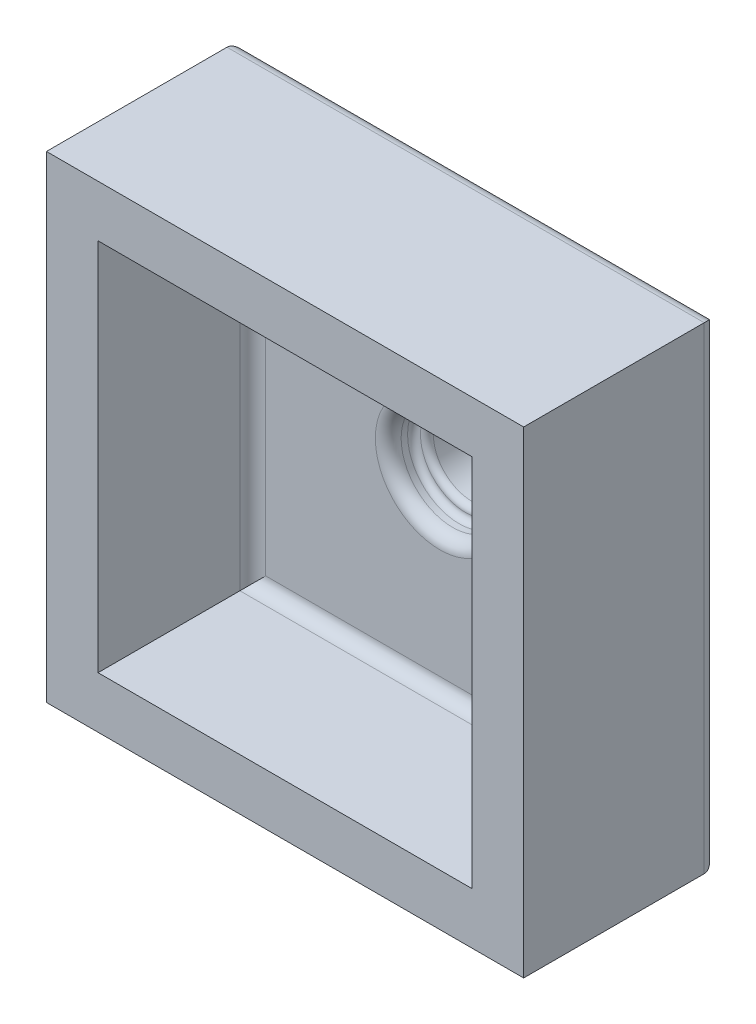
ISO-10303-21;
HEADER;
FILE_DESCRIPTION(('STEP AP214'),'2;1');
FILE_NAME('part.step','',(''),(''),'','','');
FILE_SCHEMA(('AUTOMOTIVE_DESIGN { 1 0 10303 214 1 1 1 1 }'));
ENDSEC;
DATA;
#1=APPLICATION_CONTEXT('core data for automotive mechanical design processes');
#2=APPLICATION_PROTOCOL_DEFINITION('international standard','automotive_design',2000,#1);
#3=PRODUCT_CONTEXT('',#1,'mechanical');
#4=PRODUCT('Part','Part','',(#3));
#5=PRODUCT_RELATED_PRODUCT_CATEGORY('part','',(#4));
#6=PRODUCT_DEFINITION_FORMATION('','',#4);
#7=PRODUCT_DEFINITION_CONTEXT('part definition',#1,'design');
#8=PRODUCT_DEFINITION('design','',#6,#7);
#9=PRODUCT_DEFINITION_SHAPE('','',#8);
#10=(LENGTH_UNIT() NAMED_UNIT(*) SI_UNIT(.MILLI.,.METRE.));
#11=(NAMED_UNIT(*) PLANE_ANGLE_UNIT() SI_UNIT($,.RADIAN.));
#12=(NAMED_UNIT(*) SI_UNIT($,.STERADIAN.) SOLID_ANGLE_UNIT());
#13=UNCERTAINTY_MEASURE_WITH_UNIT(LENGTH_MEASURE(1.E-05),#10,'distance_accuracy_value','');
#14=(GEOMETRIC_REPRESENTATION_CONTEXT(3) GLOBAL_UNCERTAINTY_ASSIGNED_CONTEXT((#13)) GLOBAL_UNIT_ASSIGNED_CONTEXT((#10,
#11,#12)) REPRESENTATION_CONTEXT('',''));
#15=CARTESIAN_POINT('',(0.,0.,0.));
#16=DIRECTION('',(0.,0.,1.));
#17=DIRECTION('',(1.,0.,0.));
#18=AXIS2_PLACEMENT_3D('',#15,#16,#17);
#19=CARTESIAN_POINT('',(0.,0.,12.));
#20=DIRECTION('',(0.,0.,-1.));
#21=DIRECTION('',(-1.,0.,0.));
#22=AXIS2_PLACEMENT_3D('',#19,#20,#21);
#23=CYLINDRICAL_SURFACE('',#22,4.);
#24=CARTESIAN_POINT('',(0.,0.,1.5));
#25=DIRECTION('',(0.,0.,-1.));
#26=DIRECTION('',(-1.,0.,0.));
#27=AXIS2_PLACEMENT_3D('',#24,#25,#26);
#28=CIRCLE('',#27,4.);
#29=CARTESIAN_POINT('',(-4.,0.,1.5));
#30=VERTEX_POINT('',#29);
#31=EDGE_CURVE('E49',#30,#30,#28,.T.);
#32=ORIENTED_EDGE('',*,*,#31,.T.);
#33=EDGE_LOOP('',(#32));
#34=FACE_BOUND('',#33,.T.);
#35=CARTESIAN_POINT('',(0.,0.,2.));
#36=DIRECTION('',(0.,0.,-1.));
#37=DIRECTION('',(-1.,0.,0.));
#38=AXIS2_PLACEMENT_3D('',#35,#36,#37);
#39=CIRCLE('',#38,4.);
#40=CARTESIAN_POINT('',(-4.,0.,2.));
#41=VERTEX_POINT('',#40);
#42=EDGE_CURVE('E272',#41,#41,#39,.F.);
#43=ORIENTED_EDGE('',*,*,#42,.T.);
#44=EDGE_LOOP('',(#43));
#45=FACE_BOUND('',#44,.T.);
#46=ADVANCED_FACE('F39',(#34,#45),#23,.F.);
#47=CARTESIAN_POINT('',(-18.5,18.5,15.));
#48=DIRECTION('',(1.,0.,0.));
#49=DIRECTION('',(0.,1.,0.));
#50=AXIS2_PLACEMENT_3D('',#47,#48,#49);
#51=PLANE('',#50);
#52=DIRECTION('',(0.,0.,-1.));
#53=VECTOR('',#52,1.);
#54=CARTESIAN_POINT('',(-18.5,18.5,15.));
#55=LINE('',#54,#53);
#56=CARTESIAN_POINT('',(-18.5,18.5,15.));
#57=VERTEX_POINT('',#56);
#58=CARTESIAN_POINT('',(-18.5,18.5,1.));
#59=VERTEX_POINT('',#58);
#60=EDGE_CURVE('E178',#57,#59,#55,.T.);
#61=ORIENTED_EDGE('',*,*,#60,.T.);
#62=DIRECTION('',(0.,-1.,0.));
#63=VECTOR('',#62,1.);
#64=CARTESIAN_POINT('',(-18.5,-18.5,1.));
#65=LINE('',#64,#63);
#66=CARTESIAN_POINT('',(-18.5,-18.5,1.));
#67=VERTEX_POINT('',#66);
#68=EDGE_CURVE('E221',#59,#67,#65,.T.);
#69=ORIENTED_EDGE('',*,*,#68,.T.);
#70=DIRECTION('',(0.,0.,-1.));
#71=VECTOR('',#70,1.);
#72=CARTESIAN_POINT('',(-18.5,-18.5,15.));
#73=LINE('',#72,#71);
#74=CARTESIAN_POINT('',(-18.5,-18.5,15.));
#75=VERTEX_POINT('',#74);
#76=EDGE_CURVE('E190',#75,#67,#73,.T.);
#77=ORIENTED_EDGE('',*,*,#76,.F.);
#78=DIRECTION('',(0.,-1.,0.));
#79=VECTOR('',#78,1.);
#80=CARTESIAN_POINT('',(-18.5,18.5,15.));
#81=LINE('',#80,#79);
#82=EDGE_CURVE('E161',#57,#75,#81,.T.);
#83=ORIENTED_EDGE('',*,*,#82,.F.);
#84=EDGE_LOOP('',(#61,#69,#77,#83));
#85=FACE_BOUND('',#84,.T.);
#86=ADVANCED_FACE('F349',(#85),#51,.F.);
#87=CARTESIAN_POINT('',(18.5,-18.5,15.));
#88=DIRECTION('',(0.,1.,0.));
#89=DIRECTION('',(-1.,0.,0.));
#90=AXIS2_PLACEMENT_3D('',#87,#88,#89);
#91=PLANE('',#90);
#92=ORIENTED_EDGE('',*,*,#76,.T.);
#93=DIRECTION('',(1.,0.,0.));
#94=VECTOR('',#93,1.);
#95=CARTESIAN_POINT('',(18.5,-18.5,1.));
#96=LINE('',#95,#94);
#97=CARTESIAN_POINT('',(18.5,-18.5,1.));
#98=VERTEX_POINT('',#97);
#99=EDGE_CURVE('E194',#67,#98,#96,.T.);
#100=ORIENTED_EDGE('',*,*,#99,.T.);
#101=DIRECTION('',(0.,0.,-1.));
#102=VECTOR('',#101,1.);
#103=CARTESIAN_POINT('',(18.5,-18.5,15.));
#104=LINE('',#103,#102);
#105=CARTESIAN_POINT('',(18.5,-18.5,15.));
#106=VERTEX_POINT('',#105);
#107=EDGE_CURVE('E186',#106,#98,#104,.T.);
#108=ORIENTED_EDGE('',*,*,#107,.F.);
#109=DIRECTION('',(1.,0.,0.));
#110=VECTOR('',#109,1.);
#111=CARTESIAN_POINT('',(18.5,-18.5,15.));
#112=LINE('',#111,#110);
#113=EDGE_CURVE('E169',#75,#106,#112,.T.);
#114=ORIENTED_EDGE('',*,*,#113,.F.);
#115=EDGE_LOOP('',(#92,#100,#108,#114));
#116=FACE_BOUND('',#115,.T.);
#117=ADVANCED_FACE('F354',(#116),#91,.F.);
#118=CARTESIAN_POINT('',(18.5,18.5,15.));
#119=DIRECTION('',(-1.,0.,0.));
#120=DIRECTION('',(0.,-1.,0.));
#121=AXIS2_PLACEMENT_3D('',#118,#119,#120);
#122=PLANE('',#121);
#123=ORIENTED_EDGE('',*,*,#107,.T.);
#124=DIRECTION('',(0.,1.,0.));
#125=VECTOR('',#124,1.);
#126=CARTESIAN_POINT('',(18.5,18.5,1.));
#127=LINE('',#126,#125);
#128=CARTESIAN_POINT('',(18.5,18.5,1.));
#129=VERTEX_POINT('',#128);
#130=EDGE_CURVE('E215',#98,#129,#127,.T.);
#131=ORIENTED_EDGE('',*,*,#130,.T.);
#132=DIRECTION('',(0.,0.,-1.));
#133=VECTOR('',#132,1.);
#134=CARTESIAN_POINT('',(18.5,18.5,15.));
#135=LINE('',#134,#133);
#136=CARTESIAN_POINT('',(18.5,18.5,15.));
#137=VERTEX_POINT('',#136);
#138=EDGE_CURVE('E182',#137,#129,#135,.T.);
#139=ORIENTED_EDGE('',*,*,#138,.F.);
#140=DIRECTION('',(0.,1.,0.));
#141=VECTOR('',#140,1.);
#142=CARTESIAN_POINT('',(18.5,18.5,15.));
#143=LINE('',#142,#141);
#144=EDGE_CURVE('E172',#106,#137,#143,.T.);
#145=ORIENTED_EDGE('',*,*,#144,.F.);
#146=EDGE_LOOP('',(#123,#131,#139,#145));
#147=FACE_BOUND('',#146,.T.);
#148=ADVANCED_FACE('F380',(#147),#122,.F.);
#149=CARTESIAN_POINT('',(18.5,18.5,15.));
#150=DIRECTION('',(0.,-1.,0.));
#151=DIRECTION('',(1.,0.,0.));
#152=AXIS2_PLACEMENT_3D('',#149,#150,#151);
#153=PLANE('',#152);
#154=ORIENTED_EDGE('',*,*,#138,.T.);
#155=DIRECTION('',(-1.,0.,0.));
#156=VECTOR('',#155,1.);
#157=CARTESIAN_POINT('',(-18.5,18.5,1.));
#158=LINE('',#157,#156);
#159=EDGE_CURVE('E218',#129,#59,#158,.T.);
#160=ORIENTED_EDGE('',*,*,#159,.T.);
#161=ORIENTED_EDGE('',*,*,#60,.F.);
#162=DIRECTION('',(-1.,0.,0.));
#163=VECTOR('',#162,1.);
#164=CARTESIAN_POINT('',(18.5,18.5,15.));
#165=LINE('',#164,#163);
#166=EDGE_CURVE('E175',#137,#57,#165,.T.);
#167=ORIENTED_EDGE('',*,*,#166,.F.);
#168=EDGE_LOOP('',(#154,#160,#161,#167));
#169=FACE_BOUND('',#168,.T.);
#170=ADVANCED_FACE('F374',(#169),#153,.F.);
#171=CARTESIAN_POINT('',(0.,0.,15.));
#172=DIRECTION('',(0.,0.,-1.));
#173=DIRECTION('',(-1.,0.,0.));
#174=AXIS2_PLACEMENT_3D('',#171,#172,#173);
#175=PLANE('',#174);
#176=DIRECTION('',(1.,0.,0.));
#177=VECTOR('',#176,1.);
#178=CARTESIAN_POINT('',(14.5,-14.5,15.));
#179=LINE('',#178,#177);
#180=CARTESIAN_POINT('',(-14.5,-14.5,15.));
#181=VERTEX_POINT('',#180);
#182=CARTESIAN_POINT('',(14.5,-14.5,15.));
#183=VERTEX_POINT('',#182);
#184=EDGE_CURVE('E140',#181,#183,#179,.T.);
#185=ORIENTED_EDGE('',*,*,#184,.F.);
#186=DIRECTION('',(0.,-1.,0.));
#187=VECTOR('',#186,1.);
#188=CARTESIAN_POINT('',(-14.5,14.5,15.));
#189=LINE('',#188,#187);
#190=CARTESIAN_POINT('',(-14.5,14.5,15.));
#191=VERTEX_POINT('',#190);
#192=EDGE_CURVE('E146',#191,#181,#189,.T.);
#193=ORIENTED_EDGE('',*,*,#192,.F.);
#194=DIRECTION('',(-1.,0.,0.));
#195=VECTOR('',#194,1.);
#196=CARTESIAN_POINT('',(14.5,14.5,15.));
#197=LINE('',#196,#195);
#198=CARTESIAN_POINT('',(14.5,14.5,15.));
#199=VERTEX_POINT('',#198);
#200=EDGE_CURVE('E151',#199,#191,#197,.T.);
#201=ORIENTED_EDGE('',*,*,#200,.F.);
#202=DIRECTION('',(0.,1.,0.));
#203=VECTOR('',#202,1.);
#204=CARTESIAN_POINT('',(14.5,14.5,15.));
#205=LINE('',#204,#203);
#206=EDGE_CURVE('E133',#183,#199,#205,.T.);
#207=ORIENTED_EDGE('',*,*,#206,.F.);
#208=EDGE_LOOP('',(#185,#193,#201,#207));
#209=FACE_BOUND('',#208,.T.);
#210=ORIENTED_EDGE('',*,*,#82,.T.);
#211=ORIENTED_EDGE('',*,*,#113,.T.);
#212=ORIENTED_EDGE('',*,*,#144,.T.);
#213=ORIENTED_EDGE('',*,*,#166,.T.);
#214=EDGE_LOOP('',(#210,#211,#212,#213));
#215=FACE_BOUND('',#214,.T.);
#216=ADVANCED_FACE('F148',(#209,#215),#175,.F.);
#217=CARTESIAN_POINT('',(0.,0.,0.));
#218=DIRECTION('',(0.,0.,-1.));
#219=DIRECTION('',(-1.,0.,0.));
#220=AXIS2_PLACEMENT_3D('',#217,#218,#219);
#221=PLANE('',#220);
#222=DIRECTION('',(0.,1.,0.));
#223=VECTOR('',#222,1.);
#224=CARTESIAN_POINT('',(17.5,-18.5,0.));
#225=LINE('',#224,#223);
#226=CARTESIAN_POINT('',(17.5,17.5,0.));
#227=VERTEX_POINT('',#226);
#228=CARTESIAN_POINT('',(17.5,-17.5,0.));
#229=VERTEX_POINT('',#228);
#230=EDGE_CURVE('E208',#227,#229,#225,.F.);
#231=ORIENTED_EDGE('',*,*,#230,.T.);
#232=DIRECTION('',(1.,0.,0.));
#233=VECTOR('',#232,1.);
#234=CARTESIAN_POINT('',(-18.5,-17.5,0.));
#235=LINE('',#234,#233);
#236=CARTESIAN_POINT('',(-17.5,-17.5,0.));
#237=VERTEX_POINT('',#236);
#238=EDGE_CURVE('E211',#229,#237,#235,.F.);
#239=ORIENTED_EDGE('',*,*,#238,.T.);
#240=DIRECTION('',(0.,-1.,0.));
#241=VECTOR('',#240,1.);
#242=CARTESIAN_POINT('',(-17.5,18.5,0.));
#243=LINE('',#242,#241);
#244=CARTESIAN_POINT('',(-17.5,17.5,0.));
#245=VERTEX_POINT('',#244);
#246=EDGE_CURVE('E202',#237,#245,#243,.F.);
#247=ORIENTED_EDGE('',*,*,#246,.T.);
#248=DIRECTION('',(-1.,0.,0.));
#249=VECTOR('',#248,1.);
#250=CARTESIAN_POINT('',(18.5,17.5,0.));
#251=LINE('',#250,#249);
#252=EDGE_CURVE('E205',#245,#227,#251,.F.);
#253=ORIENTED_EDGE('',*,*,#252,.T.);
#254=EDGE_LOOP('',(#231,#239,#247,#253));
#255=FACE_BOUND('',#254,.T.);
#256=CARTESIAN_POINT('',(0.,0.,0.));
#257=DIRECTION('',(0.,0.,-1.));
#258=DIRECTION('',(-1.,0.,0.));
#259=AXIS2_PLACEMENT_3D('',#256,#257,#258);
#260=CIRCLE('',#259,5.);
#261=CARTESIAN_POINT('',(-5.,0.,0.));
#262=VERTEX_POINT('',#261);
#263=EDGE_CURVE('E198',#262,#262,#260,.F.);
#264=ORIENTED_EDGE('',*,*,#263,.T.);
#265=EDGE_LOOP('',(#264));
#266=FACE_BOUND('',#265,.T.);
#267=ADVANCED_FACE('F371',(#255,#266),#221,.T.);
#268=CARTESIAN_POINT('',(-14.5,14.5,3.));
#269=DIRECTION('',(-1.,0.,0.));
#270=DIRECTION('',(0.,-1.,0.));
#271=AXIS2_PLACEMENT_3D('',#268,#269,#270);
#272=PLANE('',#271);
#273=DIRECTION('',(0.,0.,1.));
#274=VECTOR('',#273,1.);
#275=CARTESIAN_POINT('',(-14.5,-14.5,3.));
#276=LINE('',#275,#274);
#277=CARTESIAN_POINT('',(-14.5,-14.5,4.));
#278=VERTEX_POINT('',#277);
#279=EDGE_CURVE('E137',#278,#181,#276,.T.);
#280=ORIENTED_EDGE('',*,*,#279,.F.);
#281=DIRECTION('',(0.,-1.,0.));
#282=VECTOR('',#281,1.);
#283=CARTESIAN_POINT('',(-14.5,14.5,4.));
#284=LINE('',#283,#282);
#285=CARTESIAN_POINT('',(-14.5,14.5,4.));
#286=VERTEX_POINT('',#285);
#287=EDGE_CURVE('E269',#278,#286,#284,.F.);
#288=ORIENTED_EDGE('',*,*,#287,.T.);
#289=DIRECTION('',(0.,0.,1.));
#290=VECTOR('',#289,1.);
#291=CARTESIAN_POINT('',(-14.5,14.5,3.));
#292=LINE('',#291,#290);
#293=EDGE_CURVE('E158',#286,#191,#292,.T.);
#294=ORIENTED_EDGE('',*,*,#293,.T.);
#295=ORIENTED_EDGE('',*,*,#192,.T.);
#296=EDGE_LOOP('',(#280,#288,#294,#295));
#297=FACE_BOUND('',#296,.T.);
#298=ADVANCED_FACE('F311',(#297),#272,.F.);
#299=CARTESIAN_POINT('',(14.5,14.5,3.));
#300=DIRECTION('',(0.,1.,0.));
#301=DIRECTION('',(-1.,0.,0.));
#302=AXIS2_PLACEMENT_3D('',#299,#300,#301);
#303=PLANE('',#302);
#304=ORIENTED_EDGE('',*,*,#293,.F.);
#305=DIRECTION('',(-1.,0.,0.));
#306=VECTOR('',#305,1.);
#307=CARTESIAN_POINT('',(14.5,14.5,4.));
#308=LINE('',#307,#306);
#309=CARTESIAN_POINT('',(14.5,14.5,4.));
#310=VERTEX_POINT('',#309);
#311=EDGE_CURVE('E261',#286,#310,#308,.F.);
#312=ORIENTED_EDGE('',*,*,#311,.T.);
#313=DIRECTION('',(0.,0.,1.));
#314=VECTOR('',#313,1.);
#315=CARTESIAN_POINT('',(14.5,14.5,3.));
#316=LINE('',#315,#314);
#317=EDGE_CURVE('E136',#310,#199,#316,.T.);
#318=ORIENTED_EDGE('',*,*,#317,.T.);
#319=ORIENTED_EDGE('',*,*,#200,.T.);
#320=EDGE_LOOP('',(#304,#312,#318,#319));
#321=FACE_BOUND('',#320,.T.);
#322=ADVANCED_FACE('F317',(#321),#303,.F.);
#323=CARTESIAN_POINT('',(14.5,14.5,3.));
#324=DIRECTION('',(1.,0.,0.));
#325=DIRECTION('',(0.,1.,0.));
#326=AXIS2_PLACEMENT_3D('',#323,#324,#325);
#327=PLANE('',#326);
#328=ORIENTED_EDGE('',*,*,#317,.F.);
#329=DIRECTION('',(0.,1.,0.));
#330=VECTOR('',#329,1.);
#331=CARTESIAN_POINT('',(14.5,-14.5,4.));
#332=LINE('',#331,#330);
#333=CARTESIAN_POINT('',(14.5,-14.5,4.));
#334=VERTEX_POINT('',#333);
#335=EDGE_CURVE('E64',#310,#334,#332,.F.);
#336=ORIENTED_EDGE('',*,*,#335,.T.);
#337=DIRECTION('',(0.,0.,1.));
#338=VECTOR('',#337,1.);
#339=CARTESIAN_POINT('',(14.5,-14.5,3.));
#340=LINE('',#339,#338);
#341=EDGE_CURVE('E129',#334,#183,#340,.T.);
#342=ORIENTED_EDGE('',*,*,#341,.T.);
#343=ORIENTED_EDGE('',*,*,#206,.T.);
#344=EDGE_LOOP('',(#328,#336,#342,#343));
#345=FACE_BOUND('',#344,.T.);
#346=ADVANCED_FACE('F131',(#345),#327,.F.);
#347=CARTESIAN_POINT('',(14.5,-14.5,3.));
#348=DIRECTION('',(0.,-1.,0.));
#349=DIRECTION('',(1.,0.,0.));
#350=AXIS2_PLACEMENT_3D('',#347,#348,#349);
#351=PLANE('',#350);
#352=ORIENTED_EDGE('',*,*,#341,.F.);
#353=DIRECTION('',(1.,0.,0.));
#354=VECTOR('',#353,1.);
#355=CARTESIAN_POINT('',(-14.5,-14.5,4.));
#356=LINE('',#355,#354);
#357=EDGE_CURVE('E56',#334,#278,#356,.F.);
#358=ORIENTED_EDGE('',*,*,#357,.T.);
#359=ORIENTED_EDGE('',*,*,#279,.T.);
#360=ORIENTED_EDGE('',*,*,#184,.T.);
#361=EDGE_LOOP('',(#352,#358,#359,#360));
#362=FACE_BOUND('',#361,.T.);
#363=ADVANCED_FACE('F141',(#362),#351,.F.);
#364=CARTESIAN_POINT('',(0.,0.,3.));
#365=DIRECTION('',(0.,0.,-1.));
#366=DIRECTION('',(-1.,0.,0.));
#367=AXIS2_PLACEMENT_3D('',#364,#365,#366);
#368=PLANE('',#367);
#369=DIRECTION('',(0.,1.,0.));
#370=VECTOR('',#369,1.);
#371=CARTESIAN_POINT('',(13.5,14.5,3.));
#372=LINE('',#371,#370);
#373=CARTESIAN_POINT('',(13.5,-13.5,3.));
#374=VERTEX_POINT('',#373);
#375=CARTESIAN_POINT('',(13.5,13.5,3.));
#376=VERTEX_POINT('',#375);
#377=EDGE_CURVE('E254',#374,#376,#372,.T.);
#378=ORIENTED_EDGE('',*,*,#377,.T.);
#379=DIRECTION('',(-1.,0.,0.));
#380=VECTOR('',#379,1.);
#381=CARTESIAN_POINT('',(-14.5,13.5,3.));
#382=LINE('',#381,#380);
#383=CARTESIAN_POINT('',(-13.5,13.5,3.));
#384=VERTEX_POINT('',#383);
#385=EDGE_CURVE('E257',#376,#384,#382,.T.);
#386=ORIENTED_EDGE('',*,*,#385,.T.);
#387=DIRECTION('',(0.,-1.,0.));
#388=VECTOR('',#387,1.);
#389=CARTESIAN_POINT('',(-13.5,-14.5,3.));
#390=LINE('',#389,#388);
#391=CARTESIAN_POINT('',(-13.5,-13.5,3.));
#392=VERTEX_POINT('',#391);
#393=EDGE_CURVE('E248',#384,#392,#390,.T.);
#394=ORIENTED_EDGE('',*,*,#393,.T.);
#395=DIRECTION('',(1.,0.,0.));
#396=VECTOR('',#395,1.);
#397=CARTESIAN_POINT('',(14.5,-13.5,3.));
#398=LINE('',#397,#396);
#399=EDGE_CURVE('E251',#392,#374,#398,.T.);
#400=ORIENTED_EDGE('',*,*,#399,.T.);
#401=EDGE_LOOP('',(#378,#386,#394,#400));
#402=FACE_BOUND('',#401,.T.);
#403=CARTESIAN_POINT('',(0.,0.,3.));
#404=DIRECTION('',(0.,0.,-1.));
#405=DIRECTION('',(-1.,0.,0.));
#406=AXIS2_PLACEMENT_3D('',#403,#404,#405);
#407=CIRCLE('',#406,5.);
#408=CARTESIAN_POINT('',(-5.,0.,3.));
#409=VERTEX_POINT('',#408);
#410=EDGE_CURVE('E228',#409,#409,#407,.T.);
#411=ORIENTED_EDGE('',*,*,#410,.T.);
#412=EDGE_LOOP('',(#411));
#413=FACE_BOUND('',#412,.T.);
#414=ADVANCED_FACE('F328',(#402,#413),#368,.F.);
#415=CARTESIAN_POINT('',(0.,0.,-11.));
#416=DIRECTION('',(0.,0.,1.));
#417=DIRECTION('',(1.,0.,0.));
#418=AXIS2_PLACEMENT_3D('',#415,#416,#417);
#419=CYLINDRICAL_SURFACE('',#418,4.);
#420=CARTESIAN_POINT('',(0.,0.,-1.));
#421=DIRECTION('',(0.,0.,-1.));
#422=DIRECTION('',(-1.,0.,0.));
#423=AXIS2_PLACEMENT_3D('',#420,#421,#422);
#424=CIRCLE('',#423,4.);
#425=CARTESIAN_POINT('',(-4.,0.,-1.));
#426=VERTEX_POINT('',#425);
#427=EDGE_CURVE('E224',#426,#426,#424,.T.);
#428=ORIENTED_EDGE('',*,*,#427,.T.);
#429=EDGE_LOOP('',(#428));
#430=FACE_BOUND('',#429,.T.);
#431=CARTESIAN_POINT('',(0.,0.,-11.));
#432=DIRECTION('',(0.,0.,-1.));
#433=DIRECTION('',(-1.,0.,0.));
#434=AXIS2_PLACEMENT_3D('',#431,#432,#433);
#435=CIRCLE('',#434,4.);
#436=CARTESIAN_POINT('',(-4.,0.,-11.));
#437=VERTEX_POINT('',#436);
#438=EDGE_CURVE('E305',#437,#437,#435,.T.);
#439=ORIENTED_EDGE('',*,*,#438,.F.);
#440=EDGE_LOOP('',(#439));
#441=FACE_BOUND('',#440,.T.);
#442=ADVANCED_FACE('F359',(#430,#441),#419,.T.);
#443=CARTESIAN_POINT('',(0.,0.,-11.));
#444=DIRECTION('',(0.,0.,-1.));
#445=DIRECTION('',(-1.,0.,0.));
#446=AXIS2_PLACEMENT_3D('',#443,#444,#445);
#447=PLANE('',#446);
#448=CARTESIAN_POINT('',(0.,0.,-11.));
#449=DIRECTION('',(0.,0.,-1.));
#450=DIRECTION('',(-1.,0.,0.));
#451=AXIS2_PLACEMENT_3D('',#448,#449,#450);
#452=CIRCLE('',#451,3.);
#453=CARTESIAN_POINT('',(-3.,0.,-11.));
#454=VERTEX_POINT('',#453);
#455=EDGE_CURVE('E244',#454,#454,#452,.T.);
#456=ORIENTED_EDGE('',*,*,#455,.F.);
#457=EDGE_LOOP('',(#456));
#458=FACE_BOUND('',#457,.T.);
#459=ORIENTED_EDGE('',*,*,#438,.T.);
#460=EDGE_LOOP('',(#459));
#461=FACE_BOUND('',#460,.T.);
#462=ADVANCED_FACE('F486',(#458,#461),#447,.T.);
#463=CARTESIAN_POINT('',(0.,0.,1.));
#464=DIRECTION('',(0.,0.,-1.));
#465=DIRECTION('',(-1.,0.,0.));
#466=AXIS2_PLACEMENT_3D('',#463,#464,#465);
#467=CYLINDRICAL_SURFACE('',#466,3.);
#468=CARTESIAN_POINT('',(0.,0.,0.5));
#469=DIRECTION('',(0.,0.,-1.));
#470=DIRECTION('',(-1.,0.,0.));
#471=AXIS2_PLACEMENT_3D('',#468,#469,#470);
#472=CIRCLE('',#471,3.);
#473=CARTESIAN_POINT('',(-3.,0.,0.5));
#474=VERTEX_POINT('',#473);
#475=EDGE_CURVE('E11',#474,#474,#472,.F.);
#476=ORIENTED_EDGE('',*,*,#475,.T.);
#477=EDGE_LOOP('',(#476));
#478=FACE_BOUND('',#477,.T.);
#479=ORIENTED_EDGE('',*,*,#455,.T.);
#480=EDGE_LOOP('',(#479));
#481=FACE_BOUND('',#480,.T.);
#482=ADVANCED_FACE('F401',(#478,#481),#467,.F.);
#483=CARTESIAN_POINT('',(18.5,17.5,1.));
#484=DIRECTION('',(1.,0.,0.));
#485=DIRECTION('',(0.,1.,0.));
#486=AXIS2_PLACEMENT_3D('',#483,#484,#485);
#487=CYLINDRICAL_SURFACE('',#486,1.);
#488=CARTESIAN_POINT('',(17.5,17.5,1.));
#489=DIRECTION('',(0.707106781186548,-0.707106781186547,0.));
#490=DIRECTION('',(0.707106781186547,0.707106781186548,0.));
#491=AXIS2_PLACEMENT_3D('',#488,#489,#490);
#492=ELLIPSE('',#491,1.41421356237309,1.);
#493=EDGE_CURVE('E236',#227,#129,#492,.T.);
#494=ORIENTED_EDGE('',*,*,#493,.F.);
#495=ORIENTED_EDGE('',*,*,#252,.F.);
#496=CARTESIAN_POINT('',(-17.5,17.5,1.));
#497=DIRECTION('',(0.707106781186547,0.707106781186548,0.));
#498=DIRECTION('',(-0.707106781186548,0.707106781186547,0.));
#499=AXIS2_PLACEMENT_3D('',#496,#497,#498);
#500=ELLIPSE('',#499,1.41421356237309,1.);
#501=EDGE_CURVE('E240',#59,#245,#500,.F.);
#502=ORIENTED_EDGE('',*,*,#501,.F.);
#503=ORIENTED_EDGE('',*,*,#159,.F.);
#504=EDGE_LOOP('',(#494,#495,#502,#503));
#505=FACE_BOUND('',#504,.T.);
#506=ADVANCED_FACE('F398',(#505),#487,.T.);
#507=CARTESIAN_POINT('',(-17.5,18.5,1.));
#508=DIRECTION('',(0.,1.,0.));
#509=DIRECTION('',(-1.,0.,0.));
#510=AXIS2_PLACEMENT_3D('',#507,#508,#509);
#511=CYLINDRICAL_SURFACE('',#510,1.);
#512=ORIENTED_EDGE('',*,*,#501,.T.);
#513=ORIENTED_EDGE('',*,*,#246,.F.);
#514=CARTESIAN_POINT('',(-17.5,-17.5,1.));
#515=DIRECTION('',(-0.707106781186548,0.707106781186547,0.));
#516=DIRECTION('',(0.707106781186547,0.707106781186548,0.));
#517=AXIS2_PLACEMENT_3D('',#514,#515,#516);
#518=ELLIPSE('',#517,1.41421356237309,1.);
#519=EDGE_CURVE('E232',#67,#237,#518,.F.);
#520=ORIENTED_EDGE('',*,*,#519,.F.);
#521=ORIENTED_EDGE('',*,*,#68,.F.);
#522=EDGE_LOOP('',(#512,#513,#520,#521));
#523=FACE_BOUND('',#522,.T.);
#524=ADVANCED_FACE('F394',(#523),#511,.T.);
#525=CARTESIAN_POINT('',(17.5,18.5,1.));
#526=DIRECTION('',(0.,-1.,0.));
#527=DIRECTION('',(1.,0.,0.));
#528=AXIS2_PLACEMENT_3D('',#525,#526,#527);
#529=CYLINDRICAL_SURFACE('',#528,1.);
#530=ORIENTED_EDGE('',*,*,#493,.T.);
#531=ORIENTED_EDGE('',*,*,#130,.F.);
#532=CARTESIAN_POINT('',(17.5,-17.5,1.));
#533=DIRECTION('',(-0.707106781186547,-0.707106781186548,0.));
#534=DIRECTION('',(0.707106781186548,-0.707106781186547,0.));
#535=AXIS2_PLACEMENT_3D('',#532,#533,#534);
#536=ELLIPSE('',#535,1.4142135623731,1.);
#537=EDGE_CURVE('E229',#229,#98,#536,.T.);
#538=ORIENTED_EDGE('',*,*,#537,.F.);
#539=ORIENTED_EDGE('',*,*,#230,.F.);
#540=EDGE_LOOP('',(#530,#531,#538,#539));
#541=FACE_BOUND('',#540,.T.);
#542=ADVANCED_FACE('F390',(#541),#529,.T.);
#543=CARTESIAN_POINT('',(18.5,-17.5,1.));
#544=DIRECTION('',(-1.,0.,0.));
#545=DIRECTION('',(0.,-1.,0.));
#546=AXIS2_PLACEMENT_3D('',#543,#544,#545);
#547=CYLINDRICAL_SURFACE('',#546,1.);
#548=ORIENTED_EDGE('',*,*,#519,.T.);
#549=ORIENTED_EDGE('',*,*,#238,.F.);
#550=ORIENTED_EDGE('',*,*,#537,.T.);
#551=ORIENTED_EDGE('',*,*,#99,.F.);
#552=EDGE_LOOP('',(#548,#549,#550,#551));
#553=FACE_BOUND('',#552,.T.);
#554=ADVANCED_FACE('F344',(#553),#547,.T.);
#555=CARTESIAN_POINT('',(0.,0.,-1.));
#556=DIRECTION('',(0.,0.,-1.));
#557=DIRECTION('',(-1.,0.,0.));
#558=AXIS2_PLACEMENT_3D('',#555,#556,#557);
#559=TOROIDAL_SURFACE('',#558,5.,1.);
#560=ORIENTED_EDGE('',*,*,#263,.F.);
#561=EDGE_LOOP('',(#560));
#562=FACE_BOUND('',#561,.T.);
#563=ORIENTED_EDGE('',*,*,#427,.F.);
#564=EDGE_LOOP('',(#563));
#565=FACE_BOUND('',#564,.T.);
#566=ADVANCED_FACE('F337',(#562,#565),#559,.F.);
#567=CARTESIAN_POINT('',(0.,-13.5,4.));
#568=DIRECTION('',(-1.,0.,0.));
#569=DIRECTION('',(0.,-1.,0.));
#570=AXIS2_PLACEMENT_3D('',#567,#568,#569);
#571=CYLINDRICAL_SURFACE('',#570,1.);
#572=CARTESIAN_POINT('',(-13.5,-13.5,4.));
#573=DIRECTION('',(-0.707106781186548,0.707106781186547,0.));
#574=DIRECTION('',(-0.707106781186547,-0.707106781186548,0.));
#575=AXIS2_PLACEMENT_3D('',#572,#573,#574);
#576=ELLIPSE('',#575,1.41421356237309,1.);
#577=EDGE_CURVE('E282',#278,#392,#576,.F.);
#578=ORIENTED_EDGE('',*,*,#577,.F.);
#579=ORIENTED_EDGE('',*,*,#357,.F.);
#580=CARTESIAN_POINT('',(13.5,-13.5,4.));
#581=DIRECTION('',(-0.707106781186547,-0.707106781186548,0.));
#582=DIRECTION('',(0.707106781186548,-0.707106781186547,0.));
#583=AXIS2_PLACEMENT_3D('',#580,#581,#582);
#584=ELLIPSE('',#583,1.41421356237309,1.);
#585=EDGE_CURVE('E233',#374,#334,#584,.T.);
#586=ORIENTED_EDGE('',*,*,#585,.F.);
#587=ORIENTED_EDGE('',*,*,#399,.F.);
#588=EDGE_LOOP('',(#578,#579,#586,#587));
#589=FACE_BOUND('',#588,.T.);
#590=ADVANCED_FACE('F335',(#589),#571,.F.);
#591=CARTESIAN_POINT('',(13.5,0.,4.));
#592=DIRECTION('',(0.,-1.,0.));
#593=DIRECTION('',(1.,0.,0.));
#594=AXIS2_PLACEMENT_3D('',#591,#592,#593);
#595=CYLINDRICAL_SURFACE('',#594,1.);
#596=ORIENTED_EDGE('',*,*,#585,.T.);
#597=ORIENTED_EDGE('',*,*,#335,.F.);
#598=CARTESIAN_POINT('',(13.5,13.5,4.));
#599=DIRECTION('',(0.707106781186548,-0.707106781186547,0.));
#600=DIRECTION('',(0.707106781186547,0.707106781186548,0.));
#601=AXIS2_PLACEMENT_3D('',#598,#599,#600);
#602=ELLIPSE('',#601,1.41421356237309,1.);
#603=EDGE_CURVE('E279',#376,#310,#602,.T.);
#604=ORIENTED_EDGE('',*,*,#603,.F.);
#605=ORIENTED_EDGE('',*,*,#377,.F.);
#606=EDGE_LOOP('',(#596,#597,#604,#605));
#607=FACE_BOUND('',#606,.T.);
#608=ADVANCED_FACE('F333',(#607),#595,.F.);
#609=CARTESIAN_POINT('',(-13.5,0.,4.));
#610=DIRECTION('',(0.,1.,0.));
#611=DIRECTION('',(-1.,0.,0.));
#612=AXIS2_PLACEMENT_3D('',#609,#610,#611);
#613=CYLINDRICAL_SURFACE('',#612,1.);
#614=ORIENTED_EDGE('',*,*,#577,.T.);
#615=ORIENTED_EDGE('',*,*,#393,.F.);
#616=CARTESIAN_POINT('',(-13.5,13.5,4.));
#617=DIRECTION('',(0.707106781186547,0.707106781186548,0.));
#618=DIRECTION('',(0.707106781186548,-0.707106781186547,0.));
#619=AXIS2_PLACEMENT_3D('',#616,#617,#618);
#620=ELLIPSE('',#619,1.41421356237309,1.);
#621=EDGE_CURVE('E276',#286,#384,#620,.F.);
#622=ORIENTED_EDGE('',*,*,#621,.F.);
#623=ORIENTED_EDGE('',*,*,#287,.F.);
#624=EDGE_LOOP('',(#614,#615,#622,#623));
#625=FACE_BOUND('',#624,.T.);
#626=ADVANCED_FACE('F325',(#625),#613,.F.);
#627=CARTESIAN_POINT('',(0.,13.5,4.));
#628=DIRECTION('',(1.,0.,0.));
#629=DIRECTION('',(0.,1.,0.));
#630=AXIS2_PLACEMENT_3D('',#627,#628,#629);
#631=CYLINDRICAL_SURFACE('',#630,1.);
#632=ORIENTED_EDGE('',*,*,#603,.T.);
#633=ORIENTED_EDGE('',*,*,#311,.F.);
#634=ORIENTED_EDGE('',*,*,#621,.T.);
#635=ORIENTED_EDGE('',*,*,#385,.F.);
#636=EDGE_LOOP('',(#632,#633,#634,#635));
#637=FACE_BOUND('',#636,.T.);
#638=ADVANCED_FACE('F320',(#637),#631,.F.);
#639=CARTESIAN_POINT('',(0.,0.,2.));
#640=DIRECTION('',(0.,0.,-1.));
#641=DIRECTION('',(-1.,0.,0.));
#642=AXIS2_PLACEMENT_3D('',#639,#640,#641);
#643=TOROIDAL_SURFACE('',#642,5.,1.);
#644=ORIENTED_EDGE('',*,*,#42,.F.);
#645=EDGE_LOOP('',(#644));
#646=FACE_BOUND('',#645,.T.);
#647=ORIENTED_EDGE('',*,*,#410,.F.);
#648=EDGE_LOOP('',(#647));
#649=FACE_BOUND('',#648,.T.);
#650=ADVANCED_FACE('F406',(#646,#649),#643,.T.);
#651=CARTESIAN_POINT('',(0.,0.,0.5));
#652=DIRECTION('',(0.,0.,-1.));
#653=DIRECTION('',(-1.,0.,0.));
#654=AXIS2_PLACEMENT_3D('',#651,#652,#653);
#655=TOROIDAL_SURFACE('',#654,3.5,0.5);
#656=ORIENTED_EDGE('',*,*,#475,.F.);
#657=EDGE_LOOP('',(#656));
#658=FACE_BOUND('',#657,.T.);
#659=CARTESIAN_POINT('',(0.,0.,1.));
#660=DIRECTION('',(0.,0.,-1.));
#661=DIRECTION('',(-1.,0.,0.));
#662=AXIS2_PLACEMENT_3D('',#659,#660,#661);
#663=CIRCLE('',#662,3.5);
#664=CARTESIAN_POINT('',(-3.5,0.,1.));
#665=VERTEX_POINT('',#664);
#666=EDGE_CURVE('E43',#665,#665,#663,.T.);
#667=ORIENTED_EDGE('',*,*,#666,.F.);
#668=EDGE_LOOP('',(#667));
#669=FACE_BOUND('',#668,.T.);
#670=ADVANCED_FACE('F41',(#658,#669),#655,.T.);
#671=CARTESIAN_POINT('',(0.,0.,1.5));
#672=DIRECTION('',(0.,0.,-1.));
#673=DIRECTION('',(-1.,0.,0.));
#674=AXIS2_PLACEMENT_3D('',#671,#672,#673);
#675=TOROIDAL_SURFACE('',#674,3.5,0.5);
#676=ORIENTED_EDGE('',*,*,#31,.F.);
#677=EDGE_LOOP('',(#676));
#678=FACE_BOUND('',#677,.T.);
#679=ORIENTED_EDGE('',*,*,#666,.T.);
#680=EDGE_LOOP('',(#679));
#681=FACE_BOUND('',#680,.T.);
#682=ADVANCED_FACE('F295',(#678,#681),#675,.F.);
#683=CLOSED_SHELL('',(#46,#86,#117,#148,#170,#216,#267,#298,#322,#346,#363,#414,#442,#462,#482,
#506,#524,#542,#554,#566,#590,#608,#626,#638,#650,#670,#682));
#684=MANIFOLD_SOLID_BREP('B2',#683);
#685=ADVANCED_BREP_SHAPE_REPRESENTATION('',(#18,#684),#14);
#686=SHAPE_DEFINITION_REPRESENTATION(#9,#685);
ENDSEC;
END-ISO-10303-21;
